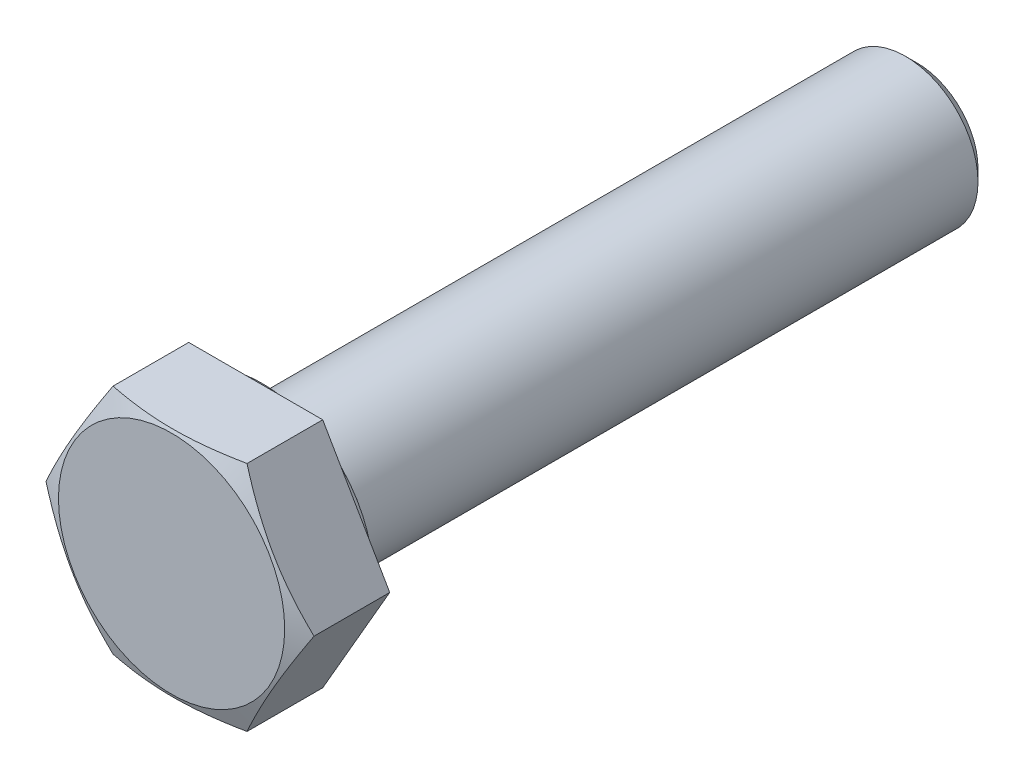
ISO-10303-21;
HEADER;
FILE_DESCRIPTION(('STEP AP214'),'2;1');
FILE_NAME('part.step','',(''),(''),'','','');
FILE_SCHEMA(('AUTOMOTIVE_DESIGN { 1 0 10303 214 1 1 1 1 }'));
ENDSEC;
DATA;
#1=APPLICATION_CONTEXT('core data for automotive mechanical design processes');
#2=APPLICATION_PROTOCOL_DEFINITION('international standard','automotive_design',2000,#1);
#3=PRODUCT_CONTEXT('',#1,'mechanical');
#4=PRODUCT('Part','Part','',(#3));
#5=PRODUCT_RELATED_PRODUCT_CATEGORY('part','',(#4));
#6=PRODUCT_DEFINITION_FORMATION('','',#4);
#7=PRODUCT_DEFINITION_CONTEXT('part definition',#1,'design');
#8=PRODUCT_DEFINITION('design','',#6,#7);
#9=PRODUCT_DEFINITION_SHAPE('','',#8);
#10=(LENGTH_UNIT() NAMED_UNIT(*) SI_UNIT(.MILLI.,.METRE.));
#11=(NAMED_UNIT(*) PLANE_ANGLE_UNIT() SI_UNIT($,.RADIAN.));
#12=(NAMED_UNIT(*) SI_UNIT($,.STERADIAN.) SOLID_ANGLE_UNIT());
#13=UNCERTAINTY_MEASURE_WITH_UNIT(LENGTH_MEASURE(1.E-05),#10,'distance_accuracy_value','');
#14=(GEOMETRIC_REPRESENTATION_CONTEXT(3) GLOBAL_UNCERTAINTY_ASSIGNED_CONTEXT((#13)) GLOBAL_UNIT_ASSIGNED_CONTEXT((#10,
#11,#12)) REPRESENTATION_CONTEXT('',''));
#15=CARTESIAN_POINT('',(0.,0.,0.));
#16=DIRECTION('',(0.,0.,1.));
#17=DIRECTION('',(1.,0.,0.));
#18=AXIS2_PLACEMENT_3D('',#15,#16,#17);
#19=CARTESIAN_POINT('',(0.,7.835,0.6));
#20=DIRECTION('',(0.,0.,1.));
#21=DIRECTION('',(1.,0.,0.));
#22=AXIS2_PLACEMENT_3D('',#19,#20,#21);
#23=PLANE('',#22);
#24=CARTESIAN_POINT('',(0.,0.,0.6));
#25=DIRECTION('',(0.,0.,1.));
#26=DIRECTION('',(1.,0.,0.));
#27=AXIS2_PLACEMENT_3D('',#24,#25,#26);
#28=CIRCLE('',#27,7.835);
#29=CARTESIAN_POINT('',(7.835,0.,0.6));
#30=VERTEX_POINT('',#29);
#31=EDGE_CURVE('E229',#30,#30,#28,.T.);
#32=ORIENTED_EDGE('',*,*,#31,.T.);
#33=EDGE_LOOP('',(#32));
#34=FACE_BOUND('',#33,.T.);
#35=DIRECTION('',(-1.,0.,0.));
#36=VECTOR('',#35,1.);
#37=CARTESIAN_POINT('',(0.,-7.99999626999913,0.6));
#38=LINE('',#37,#36);
#39=CARTESIAN_POINT('',(4.6188,-7.99999626999913,0.6));
#40=VERTEX_POINT('',#39);
#41=CARTESIAN_POINT('',(-4.6188,-7.99999626999914,0.6));
#42=VERTEX_POINT('',#41);
#43=EDGE_CURVE('E215',#40,#42,#38,.T.);
#44=ORIENTED_EDGE('',*,*,#43,.T.);
#45=DIRECTION('',(-0.5,0.866025403784439,0.));
#46=VECTOR('',#45,1.);
#47=CARTESIAN_POINT('',(-10.3208545193255,1.87625186500043,0.6));
#48=LINE('',#47,#46);
#49=CARTESIAN_POINT('',(-9.2376,0.,0.6));
#50=VERTEX_POINT('',#49);
#51=EDGE_CURVE('E84',#42,#50,#48,.T.);
#52=ORIENTED_EDGE('',*,*,#51,.T.);
#53=DIRECTION('',(0.5,0.866025403784439,0.));
#54=VECTOR('',#53,1.);
#55=CARTESIAN_POINT('',(-3.53554548067446,9.87624813499957,0.6));
#56=LINE('',#55,#54);
#57=CARTESIAN_POINT('',(-4.6188,7.99999626999913,0.6));
#58=VERTEX_POINT('',#57);
#59=EDGE_CURVE('E223',#50,#58,#56,.T.);
#60=ORIENTED_EDGE('',*,*,#59,.T.);
#61=DIRECTION('',(1.,0.,0.));
#62=VECTOR('',#61,1.);
#63=CARTESIAN_POINT('',(0.,7.99999626999913,0.6));
#64=LINE('',#63,#62);
#65=CARTESIAN_POINT('',(4.6188,7.99999626999913,0.6));
#66=VERTEX_POINT('',#65);
#67=EDGE_CURVE('E220',#58,#66,#64,.T.);
#68=ORIENTED_EDGE('',*,*,#67,.T.);
#69=DIRECTION('',(0.5,-0.866025403784439,0.));
#70=VECTOR('',#69,1.);
#71=CARTESIAN_POINT('',(3.53554548067446,9.87624813499957,0.6));
#72=LINE('',#71,#70);
#73=CARTESIAN_POINT('',(9.2376,0.,0.6));
#74=VERTEX_POINT('',#73);
#75=EDGE_CURVE('E218',#66,#74,#72,.T.);
#76=ORIENTED_EDGE('',*,*,#75,.T.);
#77=DIRECTION('',(-0.5,-0.866025403784439,0.));
#78=VECTOR('',#77,1.);
#79=CARTESIAN_POINT('',(10.3208545193255,1.87625186500043,0.6));
#80=LINE('',#79,#78);
#81=EDGE_CURVE('E203',#74,#40,#80,.T.);
#82=ORIENTED_EDGE('',*,*,#81,.T.);
#83=EDGE_LOOP('',(#44,#52,#60,#68,#76,#82));
#84=FACE_BOUND('',#83,.T.);
#85=ADVANCED_FACE('F17',(#34,#84),#23,.F.);
#86=CARTESIAN_POINT('',(0.,0.,-45.));
#87=DIRECTION('',(0.,0.,1.));
#88=DIRECTION('',(1.,0.,0.));
#89=AXIS2_PLACEMENT_3D('',#86,#87,#88);
#90=PLANE('',#89);
#91=CARTESIAN_POINT('',(0.,0.,-45.));
#92=DIRECTION('',(0.,0.,1.));
#93=DIRECTION('',(1.,0.,0.));
#94=AXIS2_PLACEMENT_3D('',#91,#92,#93);
#95=CIRCLE('',#94,4.188125);
#96=CARTESIAN_POINT('',(4.188125,0.,-45.));
#97=VERTEX_POINT('',#96);
#98=EDGE_CURVE('E77',#97,#97,#95,.T.);
#99=ORIENTED_EDGE('',*,*,#98,.F.);
#100=EDGE_LOOP('',(#99));
#101=FACE_BOUND('',#100,.T.);
#102=ADVANCED_FACE('F19',(#101),#90,.F.);
#103=CARTESIAN_POINT('',(0.,0.,-45.));
#104=DIRECTION('',(0.,0.,1.));
#105=DIRECTION('',(1.,0.,0.));
#106=AXIS2_PLACEMENT_3D('',#103,#104,#105);
#107=CONICAL_SURFACE('',#106,4.188125,0.785398163397448);
#108=CARTESIAN_POINT('',(0.,0.,-44.188125));
#109=DIRECTION('',(0.,0.,1.));
#110=DIRECTION('',(1.,0.,0.));
#111=AXIS2_PLACEMENT_3D('',#108,#109,#110);
#112=CIRCLE('',#111,5.);
#113=CARTESIAN_POINT('',(5.,0.,-44.188125));
#114=VERTEX_POINT('',#113);
#115=EDGE_CURVE('E173',#114,#114,#112,.T.);
#116=ORIENTED_EDGE('',*,*,#115,.F.);
#117=EDGE_LOOP('',(#116));
#118=FACE_BOUND('',#117,.T.);
#119=ORIENTED_EDGE('',*,*,#98,.T.);
#120=EDGE_LOOP('',(#119));
#121=FACE_BOUND('',#120,.T.);
#122=ADVANCED_FACE('F135',(#118,#121),#107,.T.);
#123=CARTESIAN_POINT('',(0.,0.,6.4));
#124=DIRECTION('',(0.,0.,1.));
#125=DIRECTION('',(1.,0.,0.));
#126=AXIS2_PLACEMENT_3D('',#123,#124,#125);
#127=CYLINDRICAL_SURFACE('',#126,5.);
#128=CARTESIAN_POINT('',(0.,0.,-1.5));
#129=DIRECTION('',(0.,0.,1.));
#130=DIRECTION('',(1.,0.,0.));
#131=AXIS2_PLACEMENT_3D('',#128,#129,#130);
#132=CIRCLE('',#131,5.);
#133=CARTESIAN_POINT('',(5.,0.,-1.5));
#134=VERTEX_POINT('',#133);
#135=EDGE_CURVE('E177',#134,#134,#132,.T.);
#136=ORIENTED_EDGE('',*,*,#135,.F.);
#137=EDGE_LOOP('',(#136));
#138=FACE_BOUND('',#137,.T.);
#139=ORIENTED_EDGE('',*,*,#115,.T.);
#140=EDGE_LOOP('',(#139));
#141=FACE_BOUND('',#140,.T.);
#142=ADVANCED_FACE('F162',(#138,#141),#127,.T.);
#143=CARTESIAN_POINT('',(0.,5.,-1.5));
#144=DIRECTION('',(0.,0.,-1.));
#145=DIRECTION('',(-1.,0.,0.));
#146=AXIS2_PLACEMENT_3D('',#143,#144,#145);
#147=PLANE('',#146);
#148=CARTESIAN_POINT('',(0.,0.,-1.5));
#149=DIRECTION('',(0.,0.,1.));
#150=DIRECTION('',(1.,0.,0.));
#151=AXIS2_PLACEMENT_3D('',#148,#149,#150);
#152=CIRCLE('',#151,4.188125);
#153=CARTESIAN_POINT('',(4.188125,0.,-1.5));
#154=VERTEX_POINT('',#153);
#155=EDGE_CURVE('E243',#154,#154,#152,.T.);
#156=ORIENTED_EDGE('',*,*,#155,.F.);
#157=EDGE_LOOP('',(#156));
#158=FACE_BOUND('',#157,.T.);
#159=ORIENTED_EDGE('',*,*,#135,.T.);
#160=EDGE_LOOP('',(#159));
#161=FACE_BOUND('',#160,.T.);
#162=ADVANCED_FACE('F158',(#158,#161),#147,.F.);
#163=CARTESIAN_POINT('',(0.,0.,-1.5));
#164=DIRECTION('',(0.,0.,1.));
#165=DIRECTION('',(1.,0.,0.));
#166=AXIS2_PLACEMENT_3D('',#163,#164,#165);
#167=CONICAL_SURFACE('',#166,4.188125,1.0471975511966);
#168=CARTESIAN_POINT('',(0.,0.,-1.03126375020167));
#169=DIRECTION('',(0.,0.,1.));
#170=DIRECTION('',(1.,0.,0.));
#171=AXIS2_PLACEMENT_3D('',#168,#169,#170);
#172=CIRCLE('',#171,5.);
#173=CARTESIAN_POINT('',(5.,0.,-1.03126375020167));
#174=VERTEX_POINT('',#173);
#175=EDGE_CURVE('E240',#174,#174,#172,.T.);
#176=ORIENTED_EDGE('',*,*,#175,.F.);
#177=EDGE_LOOP('',(#176));
#178=FACE_BOUND('',#177,.T.);
#179=ORIENTED_EDGE('',*,*,#155,.T.);
#180=EDGE_LOOP('',(#179));
#181=FACE_BOUND('',#180,.T.);
#182=ADVANCED_FACE('F154',(#178,#181),#167,.T.);
#183=CARTESIAN_POINT('',(0.,0.,6.4));
#184=DIRECTION('',(0.,0.,1.));
#185=DIRECTION('',(1.,0.,0.));
#186=AXIS2_PLACEMENT_3D('',#183,#184,#185);
#187=CYLINDRICAL_SURFACE('',#186,5.);
#188=CARTESIAN_POINT('',(0.,0.,-0.5));
#189=DIRECTION('',(0.,0.,1.));
#190=DIRECTION('',(1.,0.,0.));
#191=AXIS2_PLACEMENT_3D('',#188,#189,#190);
#192=CIRCLE('',#191,5.);
#193=CARTESIAN_POINT('',(5.,0.,-0.5));
#194=VERTEX_POINT('',#193);
#195=EDGE_CURVE('E237',#194,#194,#192,.T.);
#196=ORIENTED_EDGE('',*,*,#195,.F.);
#197=EDGE_LOOP('',(#196));
#198=FACE_BOUND('',#197,.T.);
#199=ORIENTED_EDGE('',*,*,#175,.T.);
#200=EDGE_LOOP('',(#199));
#201=FACE_BOUND('',#200,.T.);
#202=ADVANCED_FACE('F150',(#198,#201),#187,.T.);
#203=CARTESIAN_POINT('',(0.,0.,-0.5));
#204=DIRECTION('',(0.,0.,1.));
#205=DIRECTION('',(1.,0.,0.));
#206=AXIS2_PLACEMENT_3D('',#203,#204,#205);
#207=TOROIDAL_SURFACE('',#206,5.5,0.5);
#208=ORIENTED_EDGE('',*,*,#195,.T.);
#209=EDGE_LOOP('',(#208));
#210=FACE_BOUND('',#209,.T.);
#211=CARTESIAN_POINT('',(0.,0.,0.));
#212=DIRECTION('',(0.,0.,1.));
#213=DIRECTION('',(1.,0.,0.));
#214=AXIS2_PLACEMENT_3D('',#211,#212,#213);
#215=CIRCLE('',#214,5.5);
#216=CARTESIAN_POINT('',(5.5,0.,0.));
#217=VERTEX_POINT('',#216);
#218=EDGE_CURVE('E234',#217,#217,#215,.T.);
#219=ORIENTED_EDGE('',*,*,#218,.F.);
#220=EDGE_LOOP('',(#219));
#221=FACE_BOUND('',#220,.T.);
#222=ADVANCED_FACE('F146',(#210,#221),#207,.F.);
#223=CARTESIAN_POINT('',(0.,5.5,0.));
#224=DIRECTION('',(0.,0.,1.));
#225=DIRECTION('',(1.,0.,0.));
#226=AXIS2_PLACEMENT_3D('',#223,#224,#225);
#227=PLANE('',#226);
#228=CARTESIAN_POINT('',(0.,0.,0.));
#229=DIRECTION('',(0.,0.,1.));
#230=DIRECTION('',(1.,0.,0.));
#231=AXIS2_PLACEMENT_3D('',#228,#229,#230);
#232=CIRCLE('',#231,7.235);
#233=CARTESIAN_POINT('',(7.235,0.,0.));
#234=VERTEX_POINT('',#233);
#235=EDGE_CURVE('E231',#234,#234,#232,.T.);
#236=ORIENTED_EDGE('',*,*,#235,.F.);
#237=EDGE_LOOP('',(#236));
#238=FACE_BOUND('',#237,.T.);
#239=ORIENTED_EDGE('',*,*,#218,.T.);
#240=EDGE_LOOP('',(#239));
#241=FACE_BOUND('',#240,.T.);
#242=ADVANCED_FACE('F142',(#238,#241),#227,.F.);
#243=CARTESIAN_POINT('',(0.,0.,0.6));
#244=DIRECTION('',(0.,0.,1.));
#245=DIRECTION('',(1.,0.,0.));
#246=AXIS2_PLACEMENT_3D('',#243,#244,#245);
#247=TOROIDAL_SURFACE('',#246,7.235,0.6);
#248=ORIENTED_EDGE('',*,*,#31,.F.);
#249=EDGE_LOOP('',(#248));
#250=FACE_BOUND('',#249,.T.);
#251=ORIENTED_EDGE('',*,*,#235,.T.);
#252=EDGE_LOOP('',(#251));
#253=FACE_BOUND('',#252,.T.);
#254=ADVANCED_FACE('F117',(#250,#253),#247,.T.);
#255=CARTESIAN_POINT('',(-4.6188,-7.99999626999914,-45.));
#256=DIRECTION('',(0.866025403784439,0.5,0.));
#257=DIRECTION('',(0.5,-0.866025403784439,0.));
#258=AXIS2_PLACEMENT_3D('',#255,#256,#257);
#259=PLANE('',#258);
#260=ORIENTED_EDGE('',*,*,#51,.F.);
#261=DIRECTION('',(0.,0.,1.));
#262=VECTOR('',#261,1.);
#263=CARTESIAN_POINT('',(-4.6188,-7.99999626999914,-45.));
#264=LINE('',#263,#262);
#265=CARTESIAN_POINT('',(-4.6188,-7.99999626999914,5.81818181818182));
#266=VERTEX_POINT('',#265);
#267=EDGE_CURVE('E37',#42,#266,#264,.T.);
#268=ORIENTED_EDGE('',*,*,#267,.T.);
#269=CARTESIAN_POINT('',(-9.23760011547005,2.E-07,5.81818177152889));
#270=CARTESIAN_POINT('',(-9.07623171472129,-0.27949806883301,5.88338258515853));
#271=CARTESIAN_POINT('',(-8.91433070210819,-0.559918848475746,5.94367122592752));
#272=CARTESIAN_POINT('',(-8.58945812556543,-1.12261465703362,6.05257118224019));
#273=CARTESIAN_POINT('',(-8.42648599150197,-1.40489067344946,6.10117565567635));
#274=CARTESIAN_POINT('',(-8.09970314529276,-1.97089516612577,6.184761290587));
#275=CARTESIAN_POINT('',(-7.93589269672047,-2.25462318586364,6.21974649593464));
#276=CARTESIAN_POINT('',(-7.60766331101915,-2.82313315843545,6.27447232251031));
#277=CARTESIAN_POINT('',(-7.44324451597322,-3.10791486517425,6.2942163022795));
#278=CARTESIAN_POINT('',(-7.11690996678201,-3.67314288463851,6.31723187847532));
#279=CARTESIAN_POINT('',(-6.95499911698342,-3.95358070278632,6.3207774869102));
#280=CARTESIAN_POINT('',(-6.631273099555,-4.51429061270428,6.31195075111144));
#281=CARTESIAN_POINT('',(-6.46945794158833,-4.79456268773732,6.29957700744152));
#282=CARTESIAN_POINT('',(-6.14641204163931,-5.35409459962584,6.25957675489639));
#283=CARTESIAN_POINT('',(-5.98518099374477,-5.63335496633677,6.23195993877167));
#284=CARTESIAN_POINT('',(-5.66348869610407,-6.190542370254,6.16281191266298));
#285=CARTESIAN_POINT('',(-5.50302737185731,-6.46846953649914,6.12128207803787));
#286=CARTESIAN_POINT('',(-5.28250881311013,-6.85041888426114,6.05563542447324));
#287=CARTESIAN_POINT('',(-5.22204978965626,-6.95513698465927,6.03674445444816));
#288=CARTESIAN_POINT('',(-5.1012744389003,-7.16432602847055,5.99731748663496));
#289=CARTESIAN_POINT('',(-5.04095809150455,-7.26879700668695,5.9767817366831));
#290=CARTESIAN_POINT('',(-4.920256619528,-7.4778580886987,5.93408711154749));
#291=CARTESIAN_POINT('',(-4.85987196725432,-7.58244737443409,5.91192291667745));
#292=CARTESIAN_POINT('',(-4.73923496522026,-7.79139679122988,5.86612783431757));
#293=CARTESIAN_POINT('',(-4.67898263055553,-7.89575689614382,5.84249678765119));
#294=CARTESIAN_POINT('',(-4.61879988452994,-7.99999646999913,5.81818177152889));
#295=B_SPLINE_CURVE_WITH_KNOTS('',3,(#269,#270,#271,#272,#273,#274,#275,#276,#277,#278,#279,
#280,#281,#282,#283,#284,#285,#286,#287,#288,#289,#290,#291,#292,#293,#294),.UNSPECIFIED.,.F.,
.F.,(4,2,2,2,2,2,2,2,2,2,2,2,4),(0.,0.98784021988882,1.97625750561452,2.96438108331277,
3.95228685688558,4.92341776965618,5.89463405830692,6.86523348116292,7.83573698458804,
8.20288448788244,8.56997677291163,8.93832669062883,9.3067166502297),.UNSPECIFIED.);
#296=CARTESIAN_POINT('',(-9.2376,0.,5.81818181818182));
#297=VERTEX_POINT('',#296);
#298=EDGE_CURVE('E11',#297,#266,#295,.T.);
#299=ORIENTED_EDGE('',*,*,#298,.F.);
#300=DIRECTION('',(0.,0.,1.));
#301=VECTOR('',#300,1.);
#302=CARTESIAN_POINT('',(-9.2376,0.,-45.));
#303=LINE('',#302,#301);
#304=EDGE_CURVE('E213',#50,#297,#303,.T.);
#305=ORIENTED_EDGE('',*,*,#304,.F.);
#306=EDGE_LOOP('',(#260,#268,#299,#305));
#307=FACE_BOUND('',#306,.T.);
#308=ADVANCED_FACE('F80',(#307),#259,.F.);
#309=CARTESIAN_POINT('',(-9.2376,0.,-45.));
#310=DIRECTION('',(0.866025403784439,-0.5,0.));
#311=DIRECTION('',(-0.5,-0.866025403784439,0.));
#312=AXIS2_PLACEMENT_3D('',#309,#310,#311);
#313=PLANE('',#312);
#314=ORIENTED_EDGE('',*,*,#59,.F.);
#315=ORIENTED_EDGE('',*,*,#304,.T.);
#316=CARTESIAN_POINT('',(-4.61879988452995,7.99999646999913,5.81818177152889));
#317=CARTESIAN_POINT('',(-4.78016828527872,7.72049820116612,5.88338258515853));
#318=CARTESIAN_POINT('',(-4.94206929789182,7.44007742152339,5.94367122592752));
#319=CARTESIAN_POINT('',(-5.26694187443458,6.87738161296552,6.0525711822402));
#320=CARTESIAN_POINT('',(-5.42991400849804,6.59510559654968,6.10117565567635));
#321=CARTESIAN_POINT('',(-5.75669685470725,6.02910110387336,6.184761290587));
#322=CARTESIAN_POINT('',(-5.92050730327955,5.7453730841355,6.21974649593464));
#323=CARTESIAN_POINT('',(-6.24873668898087,5.17686311156369,6.27447232251031));
#324=CARTESIAN_POINT('',(-6.4131554840268,4.89208140482489,6.2942163022795));
#325=CARTESIAN_POINT('',(-6.73949003321801,4.32685338536063,6.31723187847532));
#326=CARTESIAN_POINT('',(-6.90140088301659,4.04641556721282,6.3207774869102));
#327=CARTESIAN_POINT('',(-7.22512690044502,3.48570565729486,6.31195075111144));
#328=CARTESIAN_POINT('',(-7.38694205841168,3.20543358226181,6.29957700744152));
#329=CARTESIAN_POINT('',(-7.7099879583607,2.6459016703733,6.25957675489639));
#330=CARTESIAN_POINT('',(-7.87121900625526,2.36664130366237,6.23195993877168));
#331=CARTESIAN_POINT('',(-8.19291130389593,1.80945389974513,6.16281191266298));
#332=CARTESIAN_POINT('',(-8.35337262814268,1.53152673349998,6.12128207803787));
#333=CARTESIAN_POINT('',(-8.57389118688987,1.14957738573799,6.05563542447324));
#334=CARTESIAN_POINT('',(-8.63435021034375,1.04485928533987,6.03674445444816));
#335=CARTESIAN_POINT('',(-8.75512556109972,0.835670241528591,5.99731748663496));
#336=CARTESIAN_POINT('',(-8.81544190849546,0.731199263312188,5.97678173668311));
#337=CARTESIAN_POINT('',(-8.93614338047201,0.522138181300445,5.93408711154749));
#338=CARTESIAN_POINT('',(-8.9965280327457,0.417548895565052,5.91192291667745));
#339=CARTESIAN_POINT('',(-9.11716503477976,0.208599478769264,5.86612783431757));
#340=CARTESIAN_POINT('',(-9.17741736944448,0.104239373855315,5.84249678765119));
#341=CARTESIAN_POINT('',(-9.23760011547005,-1.99999999595386E-07,5.81818177152889));
#342=B_SPLINE_CURVE_WITH_KNOTS('',3,(#316,#317,#318,#319,#320,#321,#322,#323,#324,#325,#326,
#327,#328,#329,#330,#331,#332,#333,#334,#335,#336,#337,#338,#339,#340,#341),.UNSPECIFIED.,.F.,
.F.,(4,2,2,2,2,2,2,2,2,2,2,2,4),(0.,0.987840219888823,1.97625750561452,2.96438108331277,
3.95228685688558,4.92341776965618,5.89463405830692,6.86523348116292,7.83573698458804,
8.20288448788244,8.56997677291163,8.93832669062883,9.3067166502297),.UNSPECIFIED.);
#343=CARTESIAN_POINT('',(-4.6188,7.99999626999913,5.81818181818182));
#344=VERTEX_POINT('',#343);
#345=EDGE_CURVE('E30',#344,#297,#342,.T.);
#346=ORIENTED_EDGE('',*,*,#345,.F.);
#347=DIRECTION('',(0.,0.,1.));
#348=VECTOR('',#347,1.);
#349=CARTESIAN_POINT('',(-4.6188,7.99999626999913,-45.));
#350=LINE('',#349,#348);
#351=EDGE_CURVE('E208',#58,#344,#350,.T.);
#352=ORIENTED_EDGE('',*,*,#351,.F.);
#353=EDGE_LOOP('',(#314,#315,#346,#352));
#354=FACE_BOUND('',#353,.T.);
#355=ADVANCED_FACE('F109',(#354),#313,.F.);
#356=CARTESIAN_POINT('',(-4.6188,7.99999626999913,-45.));
#357=DIRECTION('',(0.,-1.,0.));
#358=DIRECTION('',(-1.,0.,0.));
#359=AXIS2_PLACEMENT_3D('',#356,#357,#358);
#360=PLANE('',#359);
#361=ORIENTED_EDGE('',*,*,#67,.F.);
#362=ORIENTED_EDGE('',*,*,#351,.T.);
#363=CARTESIAN_POINT('',(-12.5719547340149,7.99999626999913,3.52982738548029));
#364=CARTESIAN_POINT('',(-12.1983187606673,7.99999626999913,3.65714990106806));
#365=CARTESIAN_POINT('',(-11.8241969469352,7.99999626999913,3.78307295335096));
#366=CARTESIAN_POINT('',(-11.0747197068484,7.99999626999913,4.03131289627139));
#367=CARTESIAN_POINT('',(-10.6993641635392,7.99999626999913,4.15362943337945));
#368=CARTESIAN_POINT('',(-9.94620503948087,7.99999626999913,4.39415137834526));
#369=CARTESIAN_POINT('',(-9.56839757440384,7.99999626999913,4.51234466706549));
#370=CARTESIAN_POINT('',(-8.81107863900985,7.99999626999913,4.74312776986415));
#371=CARTESIAN_POINT('',(-8.43156721083869,7.99999626999913,4.85571772171209));
#372=CARTESIAN_POINT('',(-7.67246142980693,7.99999626999913,5.07327543108494));
#373=CARTESIAN_POINT('',(-7.29287748662501,7.99999626999913,5.1782793220986));
#374=CARTESIAN_POINT('',(-6.53133965264957,7.99999626999913,5.37943691920654));
#375=CARTESIAN_POINT('',(-6.14938567751682,7.99999626999913,5.47559030839922));
#376=CARTESIAN_POINT('',(-5.38308686961207,7.99999626999913,5.65661961903848));
#377=CARTESIAN_POINT('',(-4.99874399547151,7.99999626999913,5.74150375865281));
#378=CARTESIAN_POINT('',(-4.22720948277043,7.99999626999913,5.89721151533283));
#379=CARTESIAN_POINT('',(-3.84001810404905,7.99999626999913,5.96803639878086));
#380=CARTESIAN_POINT('',(-3.15468340585432,7.99999626999913,6.07772100087915));
#381=CARTESIAN_POINT('',(-2.85711851931121,7.99999626999913,6.12017938018357));
#382=CARTESIAN_POINT('',(-2.26056309916768,7.99999626999913,6.19360511778826));
#383=CARTESIAN_POINT('',(-1.96157260402379,7.99999626999913,6.22457278430012));
#384=CARTESIAN_POINT('',(-1.36269467614755,7.99999626999913,6.27378877628721));
#385=CARTESIAN_POINT('',(-1.06280781111013,7.99999626999913,6.29204392124242));
#386=CARTESIAN_POINT('',(-0.462511583090257,7.99999626999913,6.31505964835441));
#387=CARTESIAN_POINT('',(-0.162102224816885,7.99999626999913,6.31982035150887));
#388=CARTESIAN_POINT('',(0.438718412699582,7.99999626999913,6.31562600125645));
#389=CARTESIAN_POINT('',(0.73912965988384,7.99999626999913,6.30666642265643));
#390=CARTESIAN_POINT('',(1.33925291570615,7.99999626999913,6.27543464071622));
#391=CARTESIAN_POINT('',(1.63896491548412,7.99999626999913,6.25316226960085));
#392=CARTESIAN_POINT('',(2.23737206586993,7.99999626999913,6.19623962338268));
#393=CARTESIAN_POINT('',(2.53606652420292,7.99999626999913,6.16158216139115));
#394=CARTESIAN_POINT('',(3.13194924548098,7.99999626999913,6.08119272582567));
#395=CARTESIAN_POINT('',(3.42913747277428,7.99999626999913,6.03546049135544));
#396=CARTESIAN_POINT('',(4.11363187826237,7.99999626999913,5.91871471186893));
#397=CARTESIAN_POINT('',(4.50034816864851,7.99999626999913,5.84425774476058));
#398=CARTESIAN_POINT('',(5.27095740839737,7.99999626999913,5.68198807089049));
#399=CARTESIAN_POINT('',(5.65485012400174,7.99999626999913,5.59417427110386));
#400=CARTESIAN_POINT('',(6.420254701543,7.99999626999913,5.40788960868629));
#401=CARTESIAN_POINT('',(6.80176506035211,7.99999626999913,5.30941262031177));
#402=CARTESIAN_POINT('',(7.5624958714302,7.99999626999913,5.10408437058317));
#403=CARTESIAN_POINT('',(7.94171640042754,7.99999626999913,4.99723339152348));
#404=CARTESIAN_POINT('',(8.6992633242296,7.99999626999913,4.77660865222803));
#405=CARTESIAN_POINT('',(9.07758437076833,7.99999626999913,4.66281661665492));
#406=CARTESIAN_POINT('',(9.83259783590634,7.99999626999913,4.42994140980718));
#407=CARTESIAN_POINT('',(10.2092902180691,7.99999626999913,4.31085812082158));
#408=CARTESIAN_POINT('',(10.9604179550956,7.99999626999913,4.06875367823657));
#409=CARTESIAN_POINT('',(11.3348565426171,7.99999626999913,3.94574252002127));
#410=CARTESIAN_POINT('',(12.0825558525415,7.99999626999913,3.69629462992552));
#411=CARTESIAN_POINT('',(12.4558166750207,7.99999626999913,3.56985819835267));
#412=CARTESIAN_POINT('',(12.8286123476855,7.99999626999913,3.44208796231302));
#413=B_SPLINE_CURVE_WITH_KNOTS('',3,(#363,#364,#365,#366,#367,#368,#369,#370,#371,#372,#373,
#374,#375,#376,#377,#378,#379,#380,#381,#382,#383,#384,#385,#386,#387,#388,#389,#390,#391,#392,
#393,#394,#395,#396,#397,#398,#399,#400,#401,#402,#403,#404,#405,#406,#407,#408,#409,#410,#411,
#412),.UNSPECIFIED.,.F.,.F.,(4,2,2,2,2,2,2,2,2,2,2,2,2,2,2,2,2,2,2,2,2,2,2,2,4),(0.,
1.18421166319394,2.36853902566283,3.55609567150066,4.74362310438696,5.92505950386828,
7.10653818948909,8.28715048564007,9.46765639027118,10.3692009941967,11.2707214145405,
12.1717578517372,13.0727862097812,13.9741118070264,14.8754487635151,15.777309604364,
16.6791916930566,17.8603375003713,19.0415800160216,20.2235047637107,21.4053896848306,
22.5905333256407,23.7757033447642,24.9580661520016,26.1403256300545),.UNSPECIFIED.);
#414=CARTESIAN_POINT('',(4.6188,7.99999626999913,5.81818181818182));
#415=VERTEX_POINT('',#414);
#416=EDGE_CURVE('E91',#415,#344,#413,.F.);
#417=ORIENTED_EDGE('',*,*,#416,.F.);
#418=DIRECTION('',(0.,0.,1.));
#419=VECTOR('',#418,1.);
#420=CARTESIAN_POINT('',(4.6188,7.99999626999913,-45.));
#421=LINE('',#420,#419);
#422=EDGE_CURVE('E205',#66,#415,#421,.T.);
#423=ORIENTED_EDGE('',*,*,#422,.F.);
#424=EDGE_LOOP('',(#361,#362,#417,#423));
#425=FACE_BOUND('',#424,.T.);
#426=ADVANCED_FACE('F112',(#425),#360,.F.);
#427=CARTESIAN_POINT('',(4.6188,7.99999626999913,-45.));
#428=DIRECTION('',(-0.866025403784439,-0.5,0.));
#429=DIRECTION('',(-0.5,0.866025403784439,0.));
#430=AXIS2_PLACEMENT_3D('',#427,#428,#429);
#431=PLANE('',#430);
#432=ORIENTED_EDGE('',*,*,#75,.F.);
#433=ORIENTED_EDGE('',*,*,#422,.T.);
#434=CARTESIAN_POINT('',(9.23760011547006,-2.00000002903711E-07,5.81818177152889));
#435=CARTESIAN_POINT('',(9.07623171472128,0.279498068833,5.88338258515853));
#436=CARTESIAN_POINT('',(8.91433070210818,0.559918848475734,5.94367122592753));
#437=CARTESIAN_POINT('',(8.58945812556542,1.1226146570336,6.0525711822402));
#438=CARTESIAN_POINT('',(8.42648599150196,1.40489067344945,6.10117565567636));
#439=CARTESIAN_POINT('',(8.09970314529275,1.97089516612576,6.18476129058701));
#440=CARTESIAN_POINT('',(7.93589269672046,2.25462318586363,6.21974649593465));
#441=CARTESIAN_POINT('',(7.60766331101913,2.82313315843544,6.27447232251031));
#442=CARTESIAN_POINT('',(7.44324451597321,3.10791486517424,6.29421630227951));
#443=CARTESIAN_POINT('',(7.116909966782,3.6731428846385,6.31723187847533));
#444=CARTESIAN_POINT('',(6.95499911698341,3.95358070278631,6.3207774869102));
#445=CARTESIAN_POINT('',(6.63127309955498,4.51429061270427,6.31195075111144));
#446=CARTESIAN_POINT('',(6.46945794158832,4.79456268773732,6.29957700744153));
#447=CARTESIAN_POINT('',(6.1464120416393,5.35409459962583,6.25957675489639));
#448=CARTESIAN_POINT('',(5.98518099374475,5.63335496633676,6.23195993877168));
#449=CARTESIAN_POINT('',(5.66348869610407,6.190542370254,6.16281191266299));
#450=CARTESIAN_POINT('',(5.50302737185732,6.46846953649915,6.12128207803787));
#451=CARTESIAN_POINT('',(5.28250881311013,6.85041888426114,6.05563542447324));
#452=CARTESIAN_POINT('',(5.22204978965625,6.95513698465926,6.03674445444816));
#453=CARTESIAN_POINT('',(5.10127443890028,7.16432602847054,5.99731748663497));
#454=CARTESIAN_POINT('',(5.04095809150454,7.26879700668694,5.97678173668311));
#455=CARTESIAN_POINT('',(4.92025661952799,7.47785808869869,5.93408711154749));
#456=CARTESIAN_POINT('',(4.85987196725431,7.58244737443408,5.91192291667746));
#457=CARTESIAN_POINT('',(4.73923496522024,7.79139679122987,5.86612783431757));
#458=CARTESIAN_POINT('',(4.67898263055552,7.89575689614382,5.8424967876512));
#459=CARTESIAN_POINT('',(4.61879988452995,7.99999646999913,5.81818177152889));
#460=B_SPLINE_CURVE_WITH_KNOTS('',3,(#434,#435,#436,#437,#438,#439,#440,#441,#442,#443,#444,
#445,#446,#447,#448,#449,#450,#451,#452,#453,#454,#455,#456,#457,#458,#459),.UNSPECIFIED.,.F.,
.F.,(4,2,2,2,2,2,2,2,2,2,2,2,4),(0.,0.987840219888824,1.97625750561453,2.96438108331277,
3.95228685688559,4.92341776965618,5.89463405830693,6.86523348116293,7.83573698458805,
8.20288448788245,8.56997677291164,8.93832669062884,9.30671665022971),.UNSPECIFIED.);
#461=CARTESIAN_POINT('',(9.2376,0.,5.81818181818182));
#462=VERTEX_POINT('',#461);
#463=EDGE_CURVE('E95',#462,#415,#460,.T.);
#464=ORIENTED_EDGE('',*,*,#463,.F.);
#465=DIRECTION('',(0.,0.,1.));
#466=VECTOR('',#465,1.);
#467=CARTESIAN_POINT('',(9.2376,0.,-45.));
#468=LINE('',#467,#466);
#469=EDGE_CURVE('E202',#74,#462,#468,.T.);
#470=ORIENTED_EDGE('',*,*,#469,.F.);
#471=EDGE_LOOP('',(#432,#433,#464,#470));
#472=FACE_BOUND('',#471,.T.);
#473=ADVANCED_FACE('F191',(#472),#431,.F.);
#474=CARTESIAN_POINT('',(9.2376,0.,-45.));
#475=DIRECTION('',(-0.866025403784439,0.5,0.));
#476=DIRECTION('',(0.5,0.866025403784439,0.));
#477=AXIS2_PLACEMENT_3D('',#474,#475,#476);
#478=PLANE('',#477);
#479=ORIENTED_EDGE('',*,*,#81,.F.);
#480=ORIENTED_EDGE('',*,*,#469,.T.);
#481=CARTESIAN_POINT('',(4.61879988452995,-7.99999646999913,5.81818177152889));
#482=CARTESIAN_POINT('',(4.78016828527872,-7.72049820116612,5.88338258515853));
#483=CARTESIAN_POINT('',(4.94206929789181,-7.44007742152338,5.94367122592753));
#484=CARTESIAN_POINT('',(5.26694187443457,-6.87738161296551,6.0525711822402));
#485=CARTESIAN_POINT('',(5.42991400849803,-6.59510559654967,6.10117565567636));
#486=CARTESIAN_POINT('',(5.75669685470724,-6.02910110387336,6.18476129058701));
#487=CARTESIAN_POINT('',(5.92050730327954,-5.74537308413549,6.21974649593465));
#488=CARTESIAN_POINT('',(6.24873668898086,-5.17686311156368,6.27447232251031));
#489=CARTESIAN_POINT('',(6.41315548402679,-4.89208140482488,6.29421630227951));
#490=CARTESIAN_POINT('',(6.739490033218,-4.32685338536062,6.31723187847533));
#491=CARTESIAN_POINT('',(6.90140088301658,-4.04641556721281,6.3207774869102));
#492=CARTESIAN_POINT('',(7.22512690044501,-3.48570565729485,6.31195075111144));
#493=CARTESIAN_POINT('',(7.38694205841167,-3.2054335822618,6.29957700744153));
#494=CARTESIAN_POINT('',(7.70998795836069,-2.64590167037329,6.25957675489639));
#495=CARTESIAN_POINT('',(7.87121900625524,-2.36664130366235,6.23195993877168));
#496=CARTESIAN_POINT('',(8.19291130389593,-1.80945389974512,6.16281191266298));
#497=CARTESIAN_POINT('',(8.35337262814268,-1.53152673349998,6.12128207803787));
#498=CARTESIAN_POINT('',(8.57389118688987,-1.14957738573798,6.05563542447324));
#499=CARTESIAN_POINT('',(8.63435021034375,-1.04485928533986,6.03674445444816));
#500=CARTESIAN_POINT('',(8.7551255610997,-0.835670241528582,5.99731748663497));
#501=CARTESIAN_POINT('',(8.81544190849545,-0.73119926331218,5.97678173668311));
#502=CARTESIAN_POINT('',(8.93614338047201,-0.522138181300438,5.93408711154749));
#503=CARTESIAN_POINT('',(8.99652803274568,-0.417548895565045,5.91192291667746));
#504=CARTESIAN_POINT('',(9.11716503477975,-0.20859947876926,5.86612783431757));
#505=CARTESIAN_POINT('',(9.17741736944447,-0.104239373855312,5.8424967876512));
#506=CARTESIAN_POINT('',(9.23760011547005,1.99999996563832E-07,5.81818177152889));
#507=B_SPLINE_CURVE_WITH_KNOTS('',3,(#481,#482,#483,#484,#485,#486,#487,#488,#489,#490,#491,
#492,#493,#494,#495,#496,#497,#498,#499,#500,#501,#502,#503,#504,#505,#506),.UNSPECIFIED.,.F.,
.F.,(4,2,2,2,2,2,2,2,2,2,2,2,4),(0.,0.987840219888824,1.97625750561453,2.96438108331277,
3.95228685688559,4.92341776965618,5.89463405830693,6.86523348116292,7.83573698458805,
8.20288448788245,8.56997677291164,8.93832669062883,9.3067166502297),.UNSPECIFIED.);
#508=CARTESIAN_POINT('',(4.6188,-7.99999626999913,5.81818181818182));
#509=VERTEX_POINT('',#508);
#510=EDGE_CURVE('E76',#509,#462,#507,.T.);
#511=ORIENTED_EDGE('',*,*,#510,.F.);
#512=DIRECTION('',(0.,0.,1.));
#513=VECTOR('',#512,1.);
#514=CARTESIAN_POINT('',(4.6188,-7.99999626999913,-45.));
#515=LINE('',#514,#513);
#516=EDGE_CURVE('E42',#40,#509,#515,.T.);
#517=ORIENTED_EDGE('',*,*,#516,.F.);
#518=EDGE_LOOP('',(#479,#480,#511,#517));
#519=FACE_BOUND('',#518,.T.);
#520=ADVANCED_FACE('F127',(#519),#478,.F.);
#521=CARTESIAN_POINT('',(4.6188,-7.99999626999913,-45.));
#522=DIRECTION('',(0.,1.,0.));
#523=DIRECTION('',(1.,0.,0.));
#524=AXIS2_PLACEMENT_3D('',#521,#522,#523);
#525=PLANE('',#524);
#526=ORIENTED_EDGE('',*,*,#43,.F.);
#527=ORIENTED_EDGE('',*,*,#516,.T.);
#528=CARTESIAN_POINT('',(-12.5719547340149,-7.99999626999914,3.52982738548029));
#529=CARTESIAN_POINT('',(-12.1983187606673,-7.99999626999914,3.65714990106806));
#530=CARTESIAN_POINT('',(-11.8241969469352,-7.99999626999914,3.78307295335096));
#531=CARTESIAN_POINT('',(-11.0747197068484,-7.99999626999914,4.03131289627139));
#532=CARTESIAN_POINT('',(-10.6993641635392,-7.99999626999914,4.15362943337945));
#533=CARTESIAN_POINT('',(-9.94620503948087,-7.99999626999914,4.39415137834526));
#534=CARTESIAN_POINT('',(-9.56839757440384,-7.99999626999914,4.51234466706549));
#535=CARTESIAN_POINT('',(-8.81107863900985,-7.99999626999914,4.74312776986415));
#536=CARTESIAN_POINT('',(-8.43156721083868,-7.99999626999914,4.85571772171209));
#537=CARTESIAN_POINT('',(-7.67246142980692,-7.99999626999914,5.07327543108494));
#538=CARTESIAN_POINT('',(-7.29287748662501,-7.99999626999914,5.17827932209861));
#539=CARTESIAN_POINT('',(-6.53133965264956,-7.99999626999914,5.37943691920654));
#540=CARTESIAN_POINT('',(-6.14938567751681,-7.99999626999913,5.47559030839922));
#541=CARTESIAN_POINT('',(-5.38308686961206,-7.99999626999913,5.65661961903848));
#542=CARTESIAN_POINT('',(-4.99874399547151,-7.99999626999914,5.7415037586528));
#543=CARTESIAN_POINT('',(-4.22720948277043,-7.99999626999913,5.89721151533283));
#544=CARTESIAN_POINT('',(-3.84001810404904,-7.99999626999913,5.96803639878086));
#545=CARTESIAN_POINT('',(-3.15468340585431,-7.99999626999913,6.07772100087915));
#546=CARTESIAN_POINT('',(-2.8571185193112,-7.99999626999913,6.12017938018357));
#547=CARTESIAN_POINT('',(-2.26056309916767,-7.99999626999913,6.19360511778826));
#548=CARTESIAN_POINT('',(-1.96157260402379,-7.99999626999913,6.22457278430012));
#549=CARTESIAN_POINT('',(-1.36269467614754,-7.99999626999913,6.27378877628721));
#550=CARTESIAN_POINT('',(-1.06280781111013,-7.99999626999913,6.29204392124242));
#551=CARTESIAN_POINT('',(-0.462511583090253,-7.99999626999913,6.31505964835441));
#552=CARTESIAN_POINT('',(-0.16210222481688,-7.99999626999913,6.31982035150887));
#553=CARTESIAN_POINT('',(0.438718412699588,-7.99999626999913,6.31562600125645));
#554=CARTESIAN_POINT('',(0.739129659883847,-7.99999626999913,6.30666642265643));
#555=CARTESIAN_POINT('',(1.33925291570616,-7.99999626999913,6.27543464071622));
#556=CARTESIAN_POINT('',(1.63896491548412,-7.99999626999913,6.25316226960085));
#557=CARTESIAN_POINT('',(2.23737206586994,-7.99999626999913,6.19623962338268));
#558=CARTESIAN_POINT('',(2.53606652420293,-7.99999626999913,6.16158216139115));
#559=CARTESIAN_POINT('',(3.13194924548098,-7.99999626999913,6.08119272582567));
#560=CARTESIAN_POINT('',(3.42913747277429,-7.99999626999913,6.03546049135544));
#561=CARTESIAN_POINT('',(4.11363187826238,-7.99999626999913,5.91871471186893));
#562=CARTESIAN_POINT('',(4.50034816864852,-7.99999626999913,5.84425774476057));
#563=CARTESIAN_POINT('',(5.27095740839738,-7.99999626999913,5.68198807089049));
#564=CARTESIAN_POINT('',(5.65485012400176,-7.99999626999913,5.59417427110385));
#565=CARTESIAN_POINT('',(6.42025470154302,-7.99999626999913,5.40788960868629));
#566=CARTESIAN_POINT('',(6.80176506035212,-7.99999626999913,5.30941262031176));
#567=CARTESIAN_POINT('',(7.56249587143022,-7.99999626999913,5.10408437058317));
#568=CARTESIAN_POINT('',(7.94171640042756,-7.99999626999913,4.99723339152348));
#569=CARTESIAN_POINT('',(8.69926332422962,-7.99999626999913,4.77660865222803));
#570=CARTESIAN_POINT('',(9.07758437076835,-7.99999626999913,4.66281661665491));
#571=CARTESIAN_POINT('',(9.83259783590636,-7.99999626999913,4.42994140980718));
#572=CARTESIAN_POINT('',(10.2092902180691,-7.99999626999913,4.31085812082157));
#573=CARTESIAN_POINT('',(10.9604179550956,-7.99999626999913,4.06875367823656));
#574=CARTESIAN_POINT('',(11.3348565426171,-7.99999626999913,3.94574252002126));
#575=CARTESIAN_POINT('',(12.0825558525415,-7.99999626999913,3.69629462992551));
#576=CARTESIAN_POINT('',(12.4558166750207,-7.99999626999912,3.56985819835267));
#577=CARTESIAN_POINT('',(12.8286123476856,-7.99999626999912,3.44208796231301));
#578=B_SPLINE_CURVE_WITH_KNOTS('',3,(#528,#529,#530,#531,#532,#533,#534,#535,#536,#537,#538,
#539,#540,#541,#542,#543,#544,#545,#546,#547,#548,#549,#550,#551,#552,#553,#554,#555,#556,#557,
#558,#559,#560,#561,#562,#563,#564,#565,#566,#567,#568,#569,#570,#571,#572,#573,#574,#575,#576,
#577),.UNSPECIFIED.,.F.,.F.,(4,2,2,2,2,2,2,2,2,2,2,2,2,2,2,2,2,2,2,2,2,2,2,2,4),(0.,
1.18421166319395,2.36853902566284,3.55609567150067,4.74362310438697,5.92505950386829,
7.1065381894891,8.28715048564007,9.46765639027118,10.3692009941967,11.2707214145405,
12.1717578517372,13.0727862097812,13.9741118070264,14.8754487635151,15.777309604364,
16.6791916930566,17.8603375003713,19.0415800160216,20.2235047637107,21.4053896848307,
22.5905333256407,23.7757033447642,24.9580661520016,26.1403256300545),.UNSPECIFIED.);
#579=EDGE_CURVE('E72',#266,#509,#578,.T.);
#580=ORIENTED_EDGE('',*,*,#579,.F.);
#581=ORIENTED_EDGE('',*,*,#267,.F.);
#582=EDGE_LOOP('',(#526,#527,#580,#581));
#583=FACE_BOUND('',#582,.T.);
#584=ADVANCED_FACE('F73',(#583),#525,.F.);
#585=CARTESIAN_POINT('',(0.,7.79754946710325,6.4));
#586=DIRECTION('',(0.,0.,-1.));
#587=DIRECTION('',(-1.,0.,0.));
#588=AXIS2_PLACEMENT_3D('',#585,#586,#587);
#589=PLANE('',#588);
#590=CARTESIAN_POINT('',(0.,0.,6.4));
#591=DIRECTION('',(0.,0.,1.));
#592=DIRECTION('',(1.,0.,0.));
#593=AXIS2_PLACEMENT_3D('',#590,#591,#592);
#594=CIRCLE('',#593,7.79754946710325);
#595=CARTESIAN_POINT('',(7.79754946710325,0.,6.4));
#596=VERTEX_POINT('',#595);
#597=EDGE_CURVE('E227',#596,#596,#594,.T.);
#598=ORIENTED_EDGE('',*,*,#597,.T.);
#599=EDGE_LOOP('',(#598));
#600=FACE_BOUND('',#599,.T.);
#601=ADVANCED_FACE('F118',(#600),#589,.F.);
#602=CARTESIAN_POINT('',(0.,0.,5.81818181818182));
#603=DIRECTION('',(0.,0.,-1.));
#604=DIRECTION('',(-1.,0.,0.));
#605=AXIS2_PLACEMENT_3D('',#602,#603,#604);
#606=CONICAL_SURFACE('',#605,9.2376,1.18682389135614);
#607=ORIENTED_EDGE('',*,*,#597,.F.);
#608=EDGE_LOOP('',(#607));
#609=FACE_BOUND('',#608,.T.);
#610=ORIENTED_EDGE('',*,*,#345,.T.);
#611=ORIENTED_EDGE('',*,*,#298,.T.);
#612=ORIENTED_EDGE('',*,*,#579,.T.);
#613=ORIENTED_EDGE('',*,*,#510,.T.);
#614=ORIENTED_EDGE('',*,*,#463,.T.);
#615=ORIENTED_EDGE('',*,*,#416,.T.);
#616=EDGE_LOOP('',(#610,#611,#612,#613,#614,#615));
#617=FACE_BOUND('',#616,.T.);
#618=ADVANCED_FACE('F88',(#609,#617),#606,.T.);
#619=CLOSED_SHELL('',(#85,#102,#122,#142,#162,#182,#202,#222,#242,#254,#308,#355,#426,#473,#520,
#584,#601,#618));
#620=MANIFOLD_SOLID_BREP('B1',#619);
#621=ADVANCED_BREP_SHAPE_REPRESENTATION('',(#18,#620),#14);
#622=SHAPE_DEFINITION_REPRESENTATION(#9,#621);
ENDSEC;
END-ISO-10303-21;
